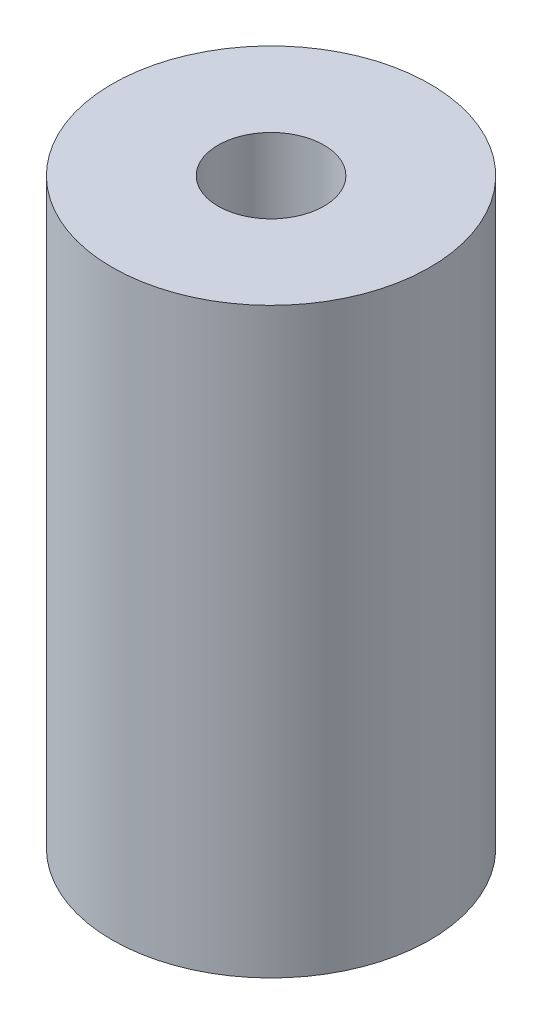
ISO-10303-21;
HEADER;
FILE_DESCRIPTION(('STEP AP214'),'2;1');
FILE_NAME('part.step','',(''),(''),'','','');
FILE_SCHEMA(('AUTOMOTIVE_DESIGN { 1 0 10303 214 1 1 1 1 }'));
ENDSEC;
DATA;
#1=APPLICATION_CONTEXT('core data for automotive mechanical design processes');
#2=APPLICATION_PROTOCOL_DEFINITION('international standard','automotive_design',2000,#1);
#3=PRODUCT_CONTEXT('',#1,'mechanical');
#4=PRODUCT('Part','Part','',(#3));
#5=PRODUCT_RELATED_PRODUCT_CATEGORY('part','',(#4));
#6=PRODUCT_DEFINITION_FORMATION('','',#4);
#7=PRODUCT_DEFINITION_CONTEXT('part definition',#1,'design');
#8=PRODUCT_DEFINITION('design','',#6,#7);
#9=PRODUCT_DEFINITION_SHAPE('','',#8);
#10=(LENGTH_UNIT() NAMED_UNIT(*) SI_UNIT(.MILLI.,.METRE.));
#11=(NAMED_UNIT(*) PLANE_ANGLE_UNIT() SI_UNIT($,.RADIAN.));
#12=(NAMED_UNIT(*) SI_UNIT($,.STERADIAN.) SOLID_ANGLE_UNIT());
#13=UNCERTAINTY_MEASURE_WITH_UNIT(LENGTH_MEASURE(1.E-05),#10,'distance_accuracy_value','');
#14=(GEOMETRIC_REPRESENTATION_CONTEXT(3) GLOBAL_UNCERTAINTY_ASSIGNED_CONTEXT((#13)) GLOBAL_UNIT_ASSIGNED_CONTEXT((#10,
#11,#12)) REPRESENTATION_CONTEXT('',''));
#15=CARTESIAN_POINT('',(0.,0.,0.));
#16=DIRECTION('',(0.,0.,1.));
#17=DIRECTION('',(1.,0.,0.));
#18=AXIS2_PLACEMENT_3D('',#15,#16,#17);
#19=CARTESIAN_POINT('',(0.,17.4625,0.));
#20=DIRECTION('',(0.,1.,0.));
#21=DIRECTION('',(0.,0.,1.));
#22=AXIS2_PLACEMENT_3D('',#19,#20,#21);
#23=PLANE('',#22);
#24=CARTESIAN_POINT('',(0.,17.4625,0.));
#25=DIRECTION('',(0.,1.,0.));
#26=DIRECTION('',(0.,0.,1.));
#27=AXIS2_PLACEMENT_3D('',#24,#25,#26);
#28=CIRCLE('',#27,4.7625);
#29=CARTESIAN_POINT('',(0.,17.4625,4.7625));
#30=VERTEX_POINT('',#29);
#31=EDGE_CURVE('E10',#30,#30,#28,.T.);
#32=ORIENTED_EDGE('',*,*,#31,.T.);
#33=EDGE_LOOP('',(#32));
#34=FACE_BOUND('',#33,.T.);
#35=CARTESIAN_POINT('',(0.,17.4625,0.));
#36=DIRECTION('',(0.,1.,0.));
#37=DIRECTION('',(0.,0.,1.));
#38=AXIS2_PLACEMENT_3D('',#35,#36,#37);
#39=CIRCLE('',#38,1.5875);
#40=CARTESIAN_POINT('',(0.,17.4625,1.5875));
#41=VERTEX_POINT('',#40);
#42=EDGE_CURVE('E58',#41,#41,#39,.T.);
#43=ORIENTED_EDGE('',*,*,#42,.F.);
#44=EDGE_LOOP('',(#43));
#45=FACE_BOUND('',#44,.T.);
#46=ADVANCED_FACE('F45',(#34,#45),#23,.T.);
#47=CARTESIAN_POINT('',(0.,0.,0.));
#48=DIRECTION('',(0.,1.,0.));
#49=DIRECTION('',(0.,0.,1.));
#50=AXIS2_PLACEMENT_3D('',#47,#48,#49);
#51=PLANE('',#50);
#52=CARTESIAN_POINT('',(0.,0.,0.));
#53=DIRECTION('',(0.,1.,0.));
#54=DIRECTION('',(0.,0.,1.));
#55=AXIS2_PLACEMENT_3D('',#52,#53,#54);
#56=CIRCLE('',#55,4.7625);
#57=CARTESIAN_POINT('',(0.,0.,4.7625));
#58=VERTEX_POINT('',#57);
#59=EDGE_CURVE('E49',#58,#58,#56,.T.);
#60=ORIENTED_EDGE('',*,*,#59,.F.);
#61=EDGE_LOOP('',(#60));
#62=FACE_BOUND('',#61,.T.);
#63=CARTESIAN_POINT('',(0.,0.,0.));
#64=DIRECTION('',(0.,1.,0.));
#65=DIRECTION('',(0.,0.,1.));
#66=AXIS2_PLACEMENT_3D('',#63,#64,#65);
#67=CIRCLE('',#66,1.5875);
#68=CARTESIAN_POINT('',(0.,0.,1.5875));
#69=VERTEX_POINT('',#68);
#70=EDGE_CURVE('E60',#69,#69,#67,.T.);
#71=ORIENTED_EDGE('',*,*,#70,.T.);
#72=EDGE_LOOP('',(#71));
#73=FACE_BOUND('',#72,.T.);
#74=ADVANCED_FACE('F72',(#62,#73),#51,.F.);
#75=CARTESIAN_POINT('',(0.,17.4625,0.));
#76=DIRECTION('',(0.,-1.,0.));
#77=DIRECTION('',(0.,0.,-1.));
#78=AXIS2_PLACEMENT_3D('',#75,#76,#77);
#79=CYLINDRICAL_SURFACE('',#78,4.7625);
#80=ORIENTED_EDGE('',*,*,#31,.F.);
#81=EDGE_LOOP('',(#80));
#82=FACE_BOUND('',#81,.T.);
#83=ORIENTED_EDGE('',*,*,#59,.T.);
#84=EDGE_LOOP('',(#83));
#85=FACE_BOUND('',#84,.T.);
#86=ADVANCED_FACE('F47',(#82,#85),#79,.T.);
#87=CARTESIAN_POINT('',(0.,17.4625,0.));
#88=DIRECTION('',(0.,-1.,0.));
#89=DIRECTION('',(0.,0.,-1.));
#90=AXIS2_PLACEMENT_3D('',#87,#88,#89);
#91=CYLINDRICAL_SURFACE('',#90,1.5875);
#92=ORIENTED_EDGE('',*,*,#42,.T.);
#93=EDGE_LOOP('',(#92));
#94=FACE_BOUND('',#93,.T.);
#95=ORIENTED_EDGE('',*,*,#70,.F.);
#96=EDGE_LOOP('',(#95));
#97=FACE_BOUND('',#96,.T.);
#98=ADVANCED_FACE('F68',(#94,#97),#91,.F.);
#99=CLOSED_SHELL('',(#46,#74,#86,#98));
#100=MANIFOLD_SOLID_BREP('B2',#99);
#101=ADVANCED_BREP_SHAPE_REPRESENTATION('',(#18,#100),#14);
#102=SHAPE_DEFINITION_REPRESENTATION(#9,#101);
ENDSEC;
END-ISO-10303-21;
